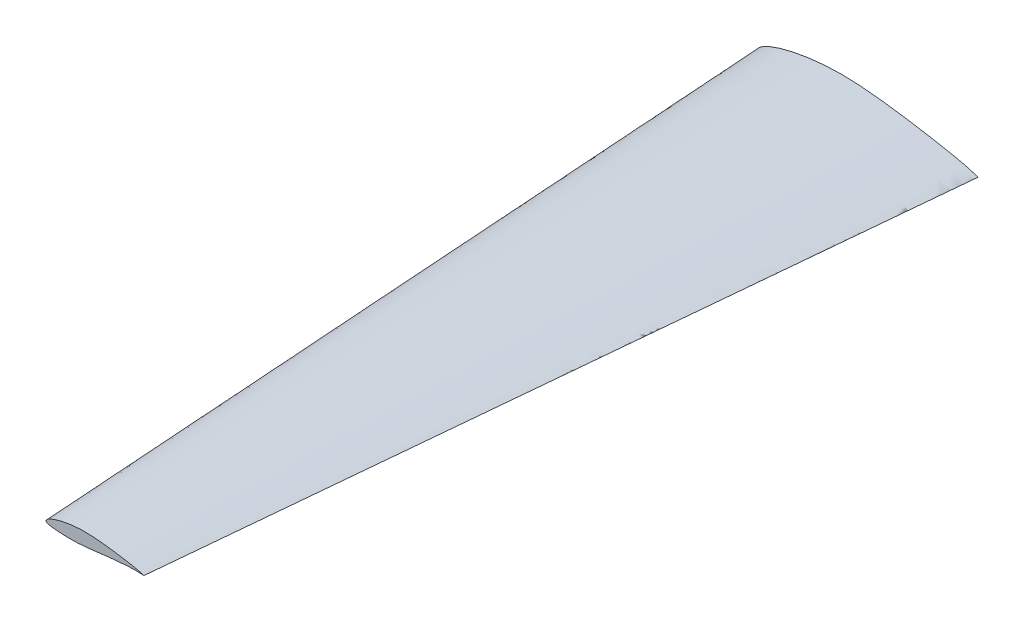
ISO-10303-21;
HEADER;
FILE_DESCRIPTION(('STEP AP214'),'2;1');
FILE_NAME('part.step','',(''),(''),'','','');
FILE_SCHEMA(('AUTOMOTIVE_DESIGN { 1 0 10303 214 1 1 1 1 }'));
ENDSEC;
DATA;
#1=APPLICATION_CONTEXT('core data for automotive mechanical design processes');
#2=APPLICATION_PROTOCOL_DEFINITION('international standard','automotive_design',2000,#1);
#3=PRODUCT_CONTEXT('',#1,'mechanical');
#4=PRODUCT('Part','Part','',(#3));
#5=PRODUCT_RELATED_PRODUCT_CATEGORY('part','',(#4));
#6=PRODUCT_DEFINITION_FORMATION('','',#4);
#7=PRODUCT_DEFINITION_CONTEXT('part definition',#1,'design');
#8=PRODUCT_DEFINITION('design','',#6,#7);
#9=PRODUCT_DEFINITION_SHAPE('','',#8);
#10=(LENGTH_UNIT() NAMED_UNIT(*) SI_UNIT(.MILLI.,.METRE.));
#11=(NAMED_UNIT(*) PLANE_ANGLE_UNIT() SI_UNIT($,.RADIAN.));
#12=(NAMED_UNIT(*) SI_UNIT($,.STERADIAN.) SOLID_ANGLE_UNIT());
#13=UNCERTAINTY_MEASURE_WITH_UNIT(LENGTH_MEASURE(1.E-05),#10,'distance_accuracy_value','');
#14=(GEOMETRIC_REPRESENTATION_CONTEXT(3) GLOBAL_UNCERTAINTY_ASSIGNED_CONTEXT((#13)) GLOBAL_UNIT_ASSIGNED_CONTEXT((#10,
#11,#12)) REPRESENTATION_CONTEXT('',''));
#15=CARTESIAN_POINT('',(0.,0.,0.));
#16=DIRECTION('',(0.,0.,1.));
#17=DIRECTION('',(1.,0.,0.));
#18=AXIS2_PLACEMENT_3D('',#15,#16,#17);
#19=CARTESIAN_POINT('',(-1154.67997113277,-18.9639866159089,0.));
#20=DIRECTION('',(0.,0.,-1.));
#21=DIRECTION('',(-1.,0.,0.));
#22=AXIS2_PLACEMENT_3D('',#19,#20,#21);
#23=PLANE('',#22);
#24=CARTESIAN_POINT('',(637.205898192704,-30.8287655417815,0.));
#25=CARTESIAN_POINT('',(637.201899095165,-30.6617141837894,0.));
#26=CARTESIAN_POINT('',(624.340560361227,-27.2829794764373,0.));
#27=CARTESIAN_POINT('',(612.180848443958,-22.4384339408856,0.));
#28=CARTESIAN_POINT('',(584.1934966163,-12.9236065949599,0.));
#29=CARTESIAN_POINT('',(550.573388405335,-3.00306264153049,0.));
#30=CARTESIAN_POINT('',(507.031775344727,7.31757291672287,0.));
#31=CARTESIAN_POINT('',(455.545202677299,18.4127610030455,0.));
#32=CARTESIAN_POINT('',(396.045342981437,30.4121098513646,0.));
#33=CARTESIAN_POINT('',(329.608830024776,43.1367783526144,0.));
#34=CARTESIAN_POINT('',(257.103677447065,56.3698310078444,0.));
#35=CARTESIAN_POINT('',(179.566044984712,69.8811959522331,0.));
#36=CARTESIAN_POINT('',(98.0040149305177,83.2871979527405,0.));
#37=CARTESIAN_POINT('',(13.4916001870969,96.2741526462915,0.));
#38=CARTESIAN_POINT('',(-72.9444245741009,108.416502290215,0.));
#39=CARTESIAN_POINT('',(-160.276589340614,119.243860555077,0.));
#40=CARTESIAN_POINT('',(-247.524811414299,128.361079009185,0.));
#41=CARTESIAN_POINT('',(-333.850816491668,135.206641048699,0.));
#42=CARTESIAN_POINT('',(-418.62279166819,139.050084763409,0.));
#43=CARTESIAN_POINT('',(-501.360886667318,139.671030910781,0.));
#44=CARTESIAN_POINT('',(-581.716263489697,136.885357982169,0.));
#45=CARTESIAN_POINT('',(-659.296624774083,130.867982416211,0.));
#46=CARTESIAN_POINT('',(-733.606389984446,122.220462802317,0.));
#47=CARTESIAN_POINT('',(-804.005192472441,111.471174797557,0.));
#48=CARTESIAN_POINT('',(-869.742959712326,98.8183249705576,0.));
#49=CARTESIAN_POINT('',(-930.149362586197,84.6626316298686,0.));
#50=CARTESIAN_POINT('',(-984.604323928922,69.3091730998716,0.));
#51=CARTESIAN_POINT('',(-1032.52610252396,53.0958706696138,0.));
#52=CARTESIAN_POINT('',(-1073.44710571588,36.391875667701,0.));
#53=CARTESIAN_POINT('',(-1106.97281951812,19.4367425763099,0.));
#54=CARTESIAN_POINT('',(-1132.81440521732,2.65228106861395,0.));
#55=CARTESIAN_POINT('',(-1147.69800566304,-10.4496016700711,0.));
#56=CARTESIAN_POINT('',(-1155.93792618086,-20.4072267704912,0.));
#57=CARTESIAN_POINT('',(-1159.73603262891,-26.1420092113419,0.));
#58=CARTESIAN_POINT('',(-1162.29687404882,-32.2887637968773,0.));
#59=CARTESIAN_POINT('',(-1163.02961498736,-36.0635081413664,0.));
#60=CARTESIAN_POINT('',(-1162.88645541477,-38.7085659438932,0.));
#61=CARTESIAN_POINT('',(-1161.82222186532,-41.1953992990109,0.));
#62=CARTESIAN_POINT('',(-1159.33848344514,-44.3902386327544,0.));
#63=CARTESIAN_POINT('',(-1154.04337356053,-49.2444985030971,0.));
#64=CARTESIAN_POINT('',(-1143.54648919571,-55.9865112754625,0.));
#65=CARTESIAN_POINT('',(-1124.17422283292,-64.496278877395,0.));
#66=CARTESIAN_POINT('',(-1094.69974337827,-73.384985572832,0.));
#67=CARTESIAN_POINT('',(-1055.14192052983,-81.756543547593,0.));
#68=CARTESIAN_POINT('',(-1007.21961769442,-89.0071543211266,0.));
#69=CARTESIAN_POINT('',(-951.470022218796,-95.2724233138396,0.));
#70=CARTESIAN_POINT('',(-888.557803111172,-100.396692502895,0.));
#71=CARTESIAN_POINT('',(-819.285797118707,-104.232978137697,0.));
#72=CARTESIAN_POINT('',(-744.520854987428,-106.629067947558,0.));
#73=CARTESIAN_POINT('',(-665.068638724127,-107.227734162227,0.));
#74=CARTESIAN_POINT('',(-581.618577699989,-105.540984685579,0.));
#75=CARTESIAN_POINT('',(-494.657700858437,-101.259128330527,0.));
#76=CARTESIAN_POINT('',(-404.474359226252,-94.1471454469288,0.));
#77=CARTESIAN_POINT('',(-311.376736229075,-84.5975961097064,0.));
#78=CARTESIAN_POINT('',(-215.89334635615,-74.0273472659613,0.));
#79=CARTESIAN_POINT('',(-119.080288018422,-63.2442750785889,0.));
#80=CARTESIAN_POINT('',(-22.3000935122685,-52.9711250135226,0.));
#81=CARTESIAN_POINT('',(72.993589670017,-43.6696490132337,0.));
#82=CARTESIAN_POINT('',(165.297776875109,-35.8584715469645,0.));
#83=CARTESIAN_POINT('',(253.084648037599,-29.7869699753317,0.));
#84=CARTESIAN_POINT('',(334.812275151983,-25.5512188260446,0.));
#85=CARTESIAN_POINT('',(409.125030592602,-23.2680963711777,0.));
#86=CARTESIAN_POINT('',(474.371672980515,-22.6259520258617,0.));
#87=CARTESIAN_POINT('',(530.172780584082,-23.5565126327113,0.));
#88=CARTESIAN_POINT('',(573.20612192453,-25.027782672938,0.));
#89=CARTESIAN_POINT('',(608.39684892439,-27.7924208570704,0.));
#90=CARTESIAN_POINT('',(622.966968367519,-28.6400352563432,0.));
#91=CARTESIAN_POINT('',(637.210029137364,-31.001324452546,0.));
#92=CARTESIAN_POINT('',(637.205898192704,-30.8287655417815,0.));
#93=B_SPLINE_CURVE_WITH_KNOTS('',3,(#24,#25,#26,#27,#28,#29,#30,#31,#32,#33,#34,#35,#36,#37,#38,
#39,#40,#41,#42,#43,#44,#45,#46,#47,#48,#49,#50,#51,#52,#53,#54,#55,#56,#57,#58,#59,#60,#61,#62,
#63,#64,#65,#66,#67,#68,#69,#70,#71,#72,#73,#74,#75,#76,#77,#78,#79,#80,#81,#82,#83,#84,#85,#86,
#87,#88,#89,#90,#91,#92),.UNSPECIFIED.,.T.,.F.,(4,1,1,1,1,1,1,1,1,1,1,1,1,1,1,1,1,1,1,1,1,1,1,1,
1,1,1,1,1,1,1,1,1,1,1,1,1,1,1,1,1,1,1,1,1,1,1,1,1,1,1,1,1,1,1,1,1,1,1,1,1,1,1,1,1,1,4),(0.,
0.00178025429931348,0.00677661855276226,0.014307631931115,0.0240462466109695,0.0361164032384218,
0.0505469730630571,0.0671298835400742,0.0856244289456062,0.10576729194862,0.127282098412942,
0.149864114045041,0.173229760189317,0.197069077892929,0.221103034083199,0.245051957369849,
0.268663179942347,0.291772797822348,0.314298508345449,0.336177511433891,0.357377359215959,
0.377791670496789,0.397224888102935,0.415489312865215,0.432417328029751,0.447849235180273,
0.461650757544391,0.473686992386839,0.483898395757803,0.492262508108233,0.498796820958936,
0.499955027372734,0.502810607326279,0.504371243067385,0.50535998755193,0.505924933279694,
0.506503368203689,0.507535007041587,0.509204749770686,0.512345281497249,0.517665407870953,
0.526421681932562,0.537424925562334,0.550643204547595,0.565965823835836,0.583206168779579,
0.6021549785986,0.622586582637333,0.644254823208852,0.666997978581174,0.690702845759673,
0.715307475272001,0.740824202204505,0.767084355637659,0.793717038600972,0.82033109971691,
0.846519300878587,0.871863223081629,0.895937170924907,0.918334876492831,0.938667169413558,
0.956573464196435,0.971715275283217,0.983839006179547,0.992717916559063,0.998161052107173,1.),.UNSPECIFIED.);
#94=CARTESIAN_POINT('',(637.205898192704,-30.8287655417815,0.));
#95=VERTEX_POINT('',#94);
#96=EDGE_CURVE('E64',#95,#95,#93,.T.);
#97=ORIENTED_EDGE('',*,*,#96,.F.);
#98=EDGE_LOOP('',(#97));
#99=FACE_BOUND('',#98,.T.);
#100=DIRECTION('',(-1.,0.,0.));
#101=VECTOR('',#100,1.);
#102=CARTESIAN_POINT('',(-378.662123766315,-50.9305698518282,0.));
#103=LINE('',#102,#101);
#104=CARTESIAN_POINT('',(-378.662123766315,-50.9305698518282,0.));
#105=VERTEX_POINT('',#104);
#106=CARTESIAN_POINT('',(-605.033690274723,-50.9305698518282,0.));
#107=VERTEX_POINT('',#106);
#108=EDGE_CURVE('E113',#105,#107,#103,.T.);
#109=ORIENTED_EDGE('',*,*,#108,.F.);
#110=DIRECTION('',(0.,-1.,0.));
#111=VECTOR('',#110,1.);
#112=CARTESIAN_POINT('',(-378.662123766315,100.87153945381,0.));
#113=LINE('',#112,#111);
#114=CARTESIAN_POINT('',(-378.662123766315,100.87153945381,0.));
#115=VERTEX_POINT('',#114);
#116=EDGE_CURVE('E127',#115,#105,#113,.T.);
#117=ORIENTED_EDGE('',*,*,#116,.F.);
#118=DIRECTION('',(1.,0.,0.));
#119=VECTOR('',#118,1.);
#120=CARTESIAN_POINT('',(-378.662123766315,100.87153945381,0.));
#121=LINE('',#120,#119);
#122=CARTESIAN_POINT('',(-605.033690274723,100.87153945381,0.));
#123=VERTEX_POINT('',#122);
#124=EDGE_CURVE('E93',#123,#115,#121,.T.);
#125=ORIENTED_EDGE('',*,*,#124,.F.);
#126=DIRECTION('',(0.,1.,0.));
#127=VECTOR('',#126,1.);
#128=CARTESIAN_POINT('',(-605.033690274723,100.87153945381,0.));
#129=LINE('',#128,#127);
#130=EDGE_CURVE('E133',#107,#123,#129,.T.);
#131=ORIENTED_EDGE('',*,*,#130,.F.);
#132=EDGE_LOOP('',(#109,#117,#125,#131));
#133=FACE_BOUND('',#132,.T.);
#134=ADVANCED_FACE('F51',(#99,#133),#23,.T.);
#135=CARTESIAN_POINT('',(-747.653077521207,-40.6182657315667,6200.));
#136=DIRECTION('',(0.,0.,-1.));
#137=DIRECTION('',(-1.,0.,0.));
#138=AXIS2_PLACEMENT_3D('',#135,#136,#137);
#139=PLANE('',#138);
#140=CARTESIAN_POINT('',(46.231204019507,-35.2354448345607,6200.));
#141=CARTESIAN_POINT('',(46.2284405656363,-35.161464044046,6200.));
#142=CARTESIAN_POINT('',(40.5107466597847,-33.7410304315181,6200.));
#143=CARTESIAN_POINT('',(35.095173755005,-31.6670699807893,6200.));
#144=CARTESIAN_POINT('',(22.6401533138637,-27.6181263346662,6200.));
#145=CARTESIAN_POINT('',(7.68738653694873,-23.4228917248776,6200.));
#146=CARTESIAN_POINT('',(-11.6630288456523,-19.1093216631822,6200.));
#147=CARTESIAN_POINT('',(-34.5376973183015,-14.4997928532483,6200.));
#148=CARTESIAN_POINT('',(-60.9676577726097,-9.5372939208794,6200.));
#149=CARTESIAN_POINT('',(-90.4748945702333,-4.29466001199642,6200.));
#150=CARTESIAN_POINT('',(-122.673585589033,1.13715909285272,6200.));
#151=CARTESIAN_POINT('',(-157.103341203516,6.66239247620247,6200.));
#152=CARTESIAN_POINT('',(-193.315298237174,12.1170555043395,6200.));
#153=CARTESIAN_POINT('',(-230.831801501577,17.3685612770775,6200.));
#154=CARTESIAN_POINT('',(-269.195458339637,22.2344819950382,6200.));
#155=CARTESIAN_POINT('',(-307.948301893932,26.5125347132972,6200.));
#156=CARTESIAN_POINT('',(-346.653804819708,30.0334858752315,6200.));
#157=CARTESIAN_POINT('',(-384.937273776908,32.5535580846316,6200.));
#158=CARTESIAN_POINT('',(-422.514475712798,33.7529045585345,6200.));
#159=CARTESIAN_POINT('',(-459.17152624748,33.5367452774346,6200.));
#160=CARTESIAN_POINT('',(-494.752795326995,31.8255847079449,6200.));
#161=CARTESIAN_POINT('',(-529.085531914352,28.6992408412461,6200.));
#162=CARTESIAN_POINT('',(-561.953763146873,24.4271493642645,6200.));
#163=CARTESIAN_POINT('',(-593.076940726259,19.2471852213284,6200.));
#164=CARTESIAN_POINT('',(-622.123955821754,13.2516082607377,6200.));
#165=CARTESIAN_POINT('',(-648.800228679982,6.62191851956731,6200.));
#166=CARTESIAN_POINT('',(-672.832873554333,-0.503051287442359,6200.));
#167=CARTESIAN_POINT('',(-693.96618270177,-7.97014647053786,6200.));
#168=CARTESIAN_POINT('',(-711.995202148996,-15.6130550209624,6200.));
#169=CARTESIAN_POINT('',(-726.74658265942,-23.3233108305785,6200.));
#170=CARTESIAN_POINT('',(-738.094871742379,-30.9123353139702,6200.));
#171=CARTESIAN_POINT('',(-744.610586604553,-36.8048992419908,6200.));
#172=CARTESIAN_POINT('',(-748.201788544685,-41.2650967461758,6200.));
#173=CARTESIAN_POINT('',(-749.850318344285,-43.828182757875,6200.));
#174=CARTESIAN_POINT('',(-750.94828793429,-46.5664283398626,6200.));
#175=CARTESIAN_POINT('',(-751.250483793828,-48.2430082792743,6200.));
#176=CARTESIAN_POINT('',(-751.171358916499,-49.4139312981977,6200.));
#177=CARTESIAN_POINT('',(-750.685133378202,-50.5092914480428,6200.));
#178=CARTESIAN_POINT('',(-749.565856882824,-51.9098735302076,6200.));
#179=CARTESIAN_POINT('',(-747.191277168439,-54.0288947151431,6200.));
#180=CARTESIAN_POINT('',(-742.501078818877,-56.9533147580623,6200.));
#181=CARTESIAN_POINT('',(-733.868548954772,-60.6081626209987,6200.));
#182=CARTESIAN_POINT('',(-720.75844147582,-64.3709023541952,6200.));
#183=CARTESIAN_POINT('',(-703.184436093652,-67.8446748921428,6200.));
#184=CARTESIAN_POINT('',(-681.911582287878,-70.772200095514,6200.));
#185=CARTESIAN_POINT('',(-657.177051439535,-73.2167412462913,6200.));
#186=CARTESIAN_POINT('',(-629.276219223052,-75.1132874538173,6200.));
#187=CARTESIAN_POINT('',(-598.56561876685,-76.4014909147392,6200.));
#188=CARTESIAN_POINT('',(-565.43017274413,-77.0190676374616,6200.));
#189=CARTESIAN_POINT('',(-530.228914169513,-76.8125475071701,6200.));
#190=CARTESIAN_POINT('',(-493.270160843118,-75.5698410912889,6200.));
#191=CARTESIAN_POINT('',(-454.771507600199,-73.1566453823038,6200.));
#192=CARTESIAN_POINT('',(-414.862090680234,-69.4705576020164,6200.));
#193=CARTESIAN_POINT('',(-373.676106035862,-64.6873134822189,6200.));
#194=CARTESIAN_POINT('',(-331.439275690689,-59.4377296716919,6200.));
#195=CARTESIAN_POINT('',(-288.614659582081,-54.0859694749774,6200.));
#196=CARTESIAN_POINT('',(-245.801574741511,-48.9603022904963,6200.));
#197=CARTESIAN_POINT('',(-203.641252257449,-44.2739171415237,6200.));
#198=CARTESIAN_POINT('',(-162.796442142331,-40.2654907769843,6200.));
#199=CARTESIAN_POINT('',(-123.942495214821,-37.0545696704387,6200.));
#200=CARTESIAN_POINT('',(-87.7619223828843,-34.6928701852552,6200.));
#201=CARTESIAN_POINT('',(-54.8545790950461,-33.2402187187982,6200.));
#202=CARTESIAN_POINT('',(-25.9538233844276,-32.5683565258773,6200.));
#203=CARTESIAN_POINT('',(-1.22814621466564,-32.6492910205264,6200.));
#204=CARTESIAN_POINT('',(17.844561028956,-33.0455684548176,6200.));
#205=CARTESIAN_POINT('',(33.4506324915198,-34.0613780335465,6200.));
#206=CARTESIAN_POINT('',(39.9102962245878,-34.3503679361492,6200.));
#207=CARTESIAN_POINT('',(46.2340585822929,-35.311864713945,6200.));
#208=CARTESIAN_POINT('',(46.231204019507,-35.2354448345607,6200.));
#209=B_SPLINE_CURVE_WITH_KNOTS('',3,(#140,#141,#142,#143,#144,#145,#146,#147,#148,#149,#150,
#151,#152,#153,#154,#155,#156,#157,#158,#159,#160,#161,#162,#163,#164,#165,#166,#167,#168,#169,
#170,#171,#172,#173,#174,#175,#176,#177,#178,#179,#180,#181,#182,#183,#184,#185,#186,#187,#188,
#189,#190,#191,#192,#193,#194,#195,#196,#197,#198,#199,#200,#201,#202,#203,#204,#205,#206,#207,
#208),.UNSPECIFIED.,.T.,.F.,(4,1,1,1,1,1,1,1,1,1,1,1,1,1,1,1,1,1,1,1,1,1,1,1,1,1,1,1,1,1,1,1,1,
1,1,1,1,1,1,1,1,1,1,1,1,1,1,1,1,1,1,1,1,1,1,1,1,1,1,1,1,1,1,1,1,1,4),(0.,0.00178025429931348,
0.00677661855276226,0.014307631931115,0.0240462466109695,0.0361164032384218,0.0505469730630571,
0.0671298835400742,0.0856244289456062,0.10576729194862,0.127282098412942,0.149864114045041,
0.173229760189317,0.197069077892929,0.221103034083199,0.245051957369849,0.268663179942347,
0.291772797822348,0.314298508345449,0.336177511433891,0.357377359215959,0.377791670496789,
0.397224888102935,0.415489312865215,0.432417328029751,0.447849235180273,0.461650757544391,
0.473686992386839,0.483898395757803,0.492262508108233,0.498796820958936,0.499955027372734,
0.502810607326279,0.504371243067385,0.50535998755193,0.505924933279694,0.506503368203689,
0.507535007041587,0.509204749770686,0.512345281497249,0.517665407870953,0.526421681932562,
0.537424925562334,0.550643204547595,0.565965823835836,0.583206168779579,0.6021549785986,
0.622586582637333,0.644254823208852,0.666997978581174,0.690702845759673,0.715307475272001,
0.740824202204505,0.767084355637659,0.793717038600972,0.82033109971691,0.846519300878587,
0.871863223081629,0.895937170924907,0.918334876492831,0.938667169413558,0.956573464196435,
0.971715275283217,0.983839006179547,0.992717916559063,0.998161052107173,1.),.UNSPECIFIED.);
#210=CARTESIAN_POINT('',(46.231204019507,-35.2354448345607,6200.));
#211=VERTEX_POINT('',#210);
#212=EDGE_CURVE('E12',#211,#211,#209,.T.);
#213=ORIENTED_EDGE('',*,*,#212,.T.);
#214=EDGE_LOOP('',(#213));
#215=FACE_BOUND('',#214,.T.);
#216=ADVANCED_FACE('F53',(#215),#139,.F.);
#217=CARTESIAN_POINT('',(-1162.90430000894,-36.010271297111,0.));
#218=CARTESIAN_POINT('',(-751.127407137551,-47.6464509229914,6200.));
#219=CARTESIAN_POINT('',(-1162.92051700588,-36.2047277608436,0.));
#220=CARTESIAN_POINT('',(-751.14142513213,-47.7317010378396,6200.));
#221=CARTESIAN_POINT('',(-1162.95828590428,-36.8333009797402,0.));
#222=CARTESIAN_POINT('',(-751.181479745274,-48.0073492187059,6200.));
#223=CARTESIAN_POINT('',(-1162.93950422828,-37.7284206728293,0.));
#224=CARTESIAN_POINT('',(-751.212003010877,-48.4002126372902,6200.));
#225=CARTESIAN_POINT('',(-1162.75806646853,-38.8399966686517,0.));
#226=CARTESIAN_POINT('',(-751.205936581557,-48.9022365528266,6200.));
#227=CARTESIAN_POINT('',(-1162.43715617724,-39.7584598613452,0.));
#228=CARTESIAN_POINT('',(-751.149350948429,-49.3294659917411,6200.));
#229=CARTESIAN_POINT('',(-1161.92646618367,-40.7891683470772,0.));
#230=CARTESIAN_POINT('',(-750.994737816625,-49.8118201361654,6200.));
#231=CARTESIAN_POINT('',(-1161.11663317046,-42.1029999132474,0.));
#232=CARTESIAN_POINT('',(-750.693102250106,-50.4312829941758,6200.));
#233=CARTESIAN_POINT('',(-1160.04083173092,-43.4261323472656,0.));
#234=CARTESIAN_POINT('',(-750.256246487288,-51.0459696479064,6200.));
#235=CARTESIAN_POINT('',(-1158.08316926316,-45.5410402952428,0.));
#236=CARTESIAN_POINT('',(-749.416488376659,-52.0107554517047,6200.));
#237=CARTESIAN_POINT('',(-1156.23019430949,-47.1974871194794,0.));
#238=CARTESIAN_POINT('',(-748.611427802237,-52.7615844367858,6200.));
#239=CARTESIAN_POINT('',(-1151.94713749663,-50.5908837566148,0.));
#240=CARTESIAN_POINT('',(-746.730863479948,-54.2879264972246,6200.));
#241=CARTESIAN_POINT('',(-1148.31391783736,-52.8911267648315,0.));
#242=CARTESIAN_POINT('',(-745.127778881206,-55.3155216976197,6200.));
#243=CARTESIAN_POINT('',(-1139.61526846819,-57.7134013644461,0.));
#244=CARTESIAN_POINT('',(-741.271616253597,-57.4518931681089,6200.));
#245=CARTESIAN_POINT('',(-1133.22446961501,-60.4976797618334,0.));
#246=CARTESIAN_POINT('',(-738.436071417425,-58.6743610617412,6200.));
#247=CARTESIAN_POINT('',(-1117.50660530661,-66.5070521851947,0.));
#248=CARTESIAN_POINT('',(-731.452005928495,-61.2861024299933,6200.));
#249=CARTESIAN_POINT('',(-1106.79674918026,-69.7192819064195,0.));
#250=CARTESIAN_POINT('',(-726.694952758834,-62.6670607253582,6200.));
#251=CARTESIAN_POINT('',(-1083.77253774689,-75.6974924010188,0.));
#252=CARTESIAN_POINT('',(-716.466679165266,-65.2097515079323,6200.));
#253=CARTESIAN_POINT('',(-1070.14798292222,-78.5687239096391,0.));
#254=CARTESIAN_POINT('',(-710.416790483915,-66.4150887779212,6200.));
#255=CARTESIAN_POINT('',(-1041.37927458624,-83.8388222163296,0.));
#256=CARTESIAN_POINT('',(-697.644342595635,-68.6007561784582,6200.));
#257=CARTESIAN_POINT('',(-1024.93131069943,-86.3194258730443,0.));
#258=CARTESIAN_POINT('',(-690.344479221008,-69.6116826334672,6200.));
#259=CARTESIAN_POINT('',(-990.692971942089,-90.8644571464163,0.));
#260=CARTESIAN_POINT('',(-675.151371615518,-71.4362702565338,6200.));
#261=CARTESIAN_POINT('',(-971.603180748062,-93.003387014006,0.));
#262=CARTESIAN_POINT('',(-666.682488130611,-72.2773083825788,6200.));
#263=CARTESIAN_POINT('',(-932.324743638965,-96.8318272346373,0.));
#264=CARTESIAN_POINT('',(-649.260178746018,-73.7517046735597,6200.));
#265=CARTESIAN_POINT('',(-910.836949284791,-98.5765530297146,0.));
#266=CARTESIAN_POINT('',(-639.73101548564,-74.4026274975686,6200.));
#267=CARTESIAN_POINT('',(-867.03305601999,-101.58873360053,0.));
#268=CARTESIAN_POINT('',(-620.308326956115,-75.486802895482,6200.));
#269=CARTESIAN_POINT('',(-843.417892861192,-102.891593827696,0.));
#270=CARTESIAN_POINT('',(-609.839170905086,-75.9286043978483,6200.));
#271=CARTESIAN_POINT('',(-795.646920766998,-104.990564101496,0.));
#272=CARTESIAN_POINT('',(-588.664210241904,-76.5836753733088,6200.));
#273=CARTESIAN_POINT('',(-770.191990263446,-105.801112322982,0.));
#274=CARTESIAN_POINT('',(-577.382832209052,-76.7962945908848,6200.));
#275=CARTESIAN_POINT('',(-719.053076037356,-106.820965663407,0.));
#276=CARTESIAN_POINT('',(-554.722067026049,-76.9537868757262,6200.));
#277=CARTESIAN_POINT('',(-692.070077807331,-107.018325104336,0.));
#278=CARTESIAN_POINT('',(-542.767268643542,-76.8861080190515,6200.));
#279=CARTESIAN_POINT('',(-638.089774283471,-106.682418977105,0.));
#280=CARTESIAN_POINT('',(-518.85553536317,-76.4273586963049,6200.));
#281=CARTESIAN_POINT('',(-609.794232768652,-106.104249085647,0.));
#282=CARTESIAN_POINT('',(-506.323726287629,-76.00875604561,6200.));
#283=CARTESIAN_POINT('',(-553.350969112621,-104.149119241392,0.));
#284=CARTESIAN_POINT('',(-481.330177815911,-74.8185266368609,6200.));
#285=CARTESIAN_POINT('',(-523.906737864093,-102.692951447115,0.));
#286=CARTESIAN_POINT('',(-468.294534369807,-74.0043038696539,6200.));
#287=CARTESIAN_POINT('',(-465.269139856987,-98.9415058180637,0.));
#288=CARTESIAN_POINT('',(-442.339202583138,-72.0054456539621,6200.));
#289=CARTESIAN_POINT('',(-434.781940137164,-96.5321580641996,0.));
#290=CARTESIAN_POINT('',(-428.847066353092,-70.7622288894901,6200.));
#291=CARTESIAN_POINT('',(-374.05437274898,-91.0267955137071,0.));
#292=CARTESIAN_POINT('',(-401.976193920792,-67.9716757541424,6200.));
#293=CARTESIAN_POINT('',(-342.52286999739,-87.7906840748762,0.));
#294=CARTESIAN_POINT('',(-388.026457907883,-66.3539298518788,6200.));
#295=CARTESIAN_POINT('',(-279.873455725877,-81.1101045705363,0.));
#296=CARTESIAN_POINT('',(-360.311756195002,-63.0254702980006,6200.));
#297=CARTESIAN_POINT('',(-247.464881019271,-77.5222479783369,0.));
#298=CARTESIAN_POINT('',(-345.97580160877,-61.2444635221544,6200.));
#299=CARTESIAN_POINT('',(-183.486970194721,-70.4179137920097,0.));
#300=CARTESIAN_POINT('',(-317.67543865908,-57.7176072400212,6200.));
#301=CARTESIAN_POINT('',(-150.6268530791,-66.7590836881734,0.));
#302=CARTESIAN_POINT('',(-303.140030241952,-55.9011941659093,6200.));
#303=CARTESIAN_POINT('',(-86.2016943412436,-59.7542353189301,0.));
#304=CARTESIAN_POINT('',(-274.641213520155,-52.4135466090698,6200.));
#305=CARTESIAN_POINT('',(-53.345595564522,-56.2684626551629,0.));
#306=CARTESIAN_POINT('',(-260.106661836917,-50.6729356073692,6200.));
#307=CARTESIAN_POINT('',(10.5846824035014,-49.7612904920643,0.));
#308=CARTESIAN_POINT('',(-231.824260001459,-47.4074556833747,6200.));
#309=CARTESIAN_POINT('',(42.9504124742033,-46.6050038311394,0.));
#310=CARTESIAN_POINT('',(-217.505056961184,-45.8149662759653,6200.));
#311=CARTESIAN_POINT('',(105.396969886383,-40.9275355616019,0.));
#312=CARTESIAN_POINT('',(-189.875157787999,-42.9241781081205,6200.));
#313=CARTESIAN_POINT('',(136.769888645999,-38.2760966996364,0.));
#314=CARTESIAN_POINT('',(-175.992823604059,-41.5605567405333,6200.));
#315=CARTESIAN_POINT('',(196.709894193326,-33.6859517027061,0.));
#316=CARTESIAN_POINT('',(-149.466929054913,-39.1653912946596,6200.));
#317=CARTESIAN_POINT('',(226.569789574539,-31.6247246782842,0.));
#318=CARTESIAN_POINT('',(-136.251337683896,-38.0717822114152,6200.));
#319=CARTESIAN_POINT('',(282.968833424865,-28.2381427663579,0.));
#320=CARTESIAN_POINT('',(-111.286803426713,-36.2300900327708,6200.));
#321=CARTESIAN_POINT('',(310.802717242567,-26.8004433482933,0.));
#322=CARTESIAN_POINT('',(-98.9651052741872,-35.4241618480409,6200.));
#323=CARTESIAN_POINT('',(362.694757549873,-24.6945809408982,0.));
#324=CARTESIAN_POINT('',(-75.9899672258875,-34.1751701427918,6200.));
#325=CARTESIAN_POINT('',(388.045353538575,-23.9206087221476,0.));
#326=CARTESIAN_POINT('',(-64.7640727036485,-33.6776603042969,6200.));
#327=CARTESIAN_POINT('',(434.408953615054,-23.0192570807243,0.));
#328=CARTESIAN_POINT('',(-44.2292297655829,-32.9951221570591,6200.));
#329=CARTESIAN_POINT('',(456.730129024212,-22.8059711790784,0.));
#330=CARTESIAN_POINT('',(-34.3430563613789,-32.763382860872,6200.));
#331=CARTESIAN_POINT('',(496.927894664348,-23.0021082033961,0.));
#332=CARTESIAN_POINT('',(-16.5382582317236,-32.6015550028647,6200.));
#333=CARTESIAN_POINT('',(516.060151013691,-23.3253514997068,0.));
#334=CARTESIAN_POINT('',(-8.05769346037086,-32.6269358813236,6200.));
#335=CARTESIAN_POINT('',(548.621162876869,-24.1872457180949,0.));
#336=CARTESIAN_POINT('',(6.38583708555751,-32.8090373118029,6200.));
#337=CARTESIAN_POINT('',(563.505640747982,-24.7085251611544,0.));
#338=CARTESIAN_POINT('',(12.9729042702342,-32.9443490727743,6200.));
#339=CARTESIAN_POINT('',(589.809000037014,-26.3321305710775,0.));
#340=CARTESIAN_POINT('',(24.5916797934128,-33.4883744378349,6200.));
#341=CARTESIAN_POINT('',(601.996348163368,-27.285401619129,0.));
#342=CARTESIAN_POINT('',(30.03006042549,-33.8387307210732,6200.));
#343=CARTESIAN_POINT('',(616.720254094529,-28.2766336393148,0.));
#344=CARTESIAN_POINT('',(36.6899311496249,-34.2045790935945,6200.));
#345=CARTESIAN_POINT('',(622.242609223136,-28.6570872428781,0.));
#346=CARTESIAN_POINT('',(39.0340366974602,-34.3111661810945,6200.));
#347=CARTESIAN_POINT('',(634.304255826598,-30.5195901374152,0.));
#348=CARTESIAN_POINT('',(44.0733446394874,-34.9879008816027,6200.));
#349=CARTESIAN_POINT('',(637.767352204719,-31.0543550713085,0.));
#350=CARTESIAN_POINT('',(45.9272473515707,-35.2652155843534,6200.));
#351=CARTESIAN_POINT('',(636.531359390657,-30.4855602219704,0.));
#352=CARTESIAN_POINT('',(46.4680358961861,-35.2384187687712,6200.));
#353=CARTESIAN_POINT('',(632.598653887573,-29.4395907888475,0.));
#354=CARTESIAN_POINT('',(45.0244696021425,-34.8623642927802,6200.));
#355=CARTESIAN_POINT('',(622.527298587213,-26.5605586418112,0.));
#356=CARTESIAN_POINT('',(40.2341206243334,-33.6034333426219,6200.));
#357=CARTESIAN_POINT('',(617.919324192789,-24.7357804732159,0.));
#358=CARTESIAN_POINT('',(38.0794627096275,-32.8099402503357,6200.));
#359=CARTESIAN_POINT('',(605.456552961758,-20.1523830515375,0.));
#360=CARTESIAN_POINT('',(32.6553805949656,-30.8788003993694,6200.));
#361=CARTESIAN_POINT('',(595.564232461683,-16.79759966716,0.));
#362=CARTESIAN_POINT('',(28.2853129879629,-29.453284574816,6200.));
#363=CARTESIAN_POINT('',(575.158949053144,-10.2577131469904,0.));
#364=CARTESIAN_POINT('',(19.1724246219445,-26.6503419030121,6200.));
#365=CARTESIAN_POINT('',(563.585645312604,-6.85409211465511,0.));
#366=CARTESIAN_POINT('',(14.0188966510992,-25.1992967714753,6200.));
#367=CARTESIAN_POINT('',(538.447932921229,-0.128975113925972,0.));
#368=CARTESIAN_POINT('',(2.85974978337416,-22.3526340151024,6200.));
#369=CARTESIAN_POINT('',(523.522197451257,3.40459866594387,0.));
#370=CARTESIAN_POINT('',(-3.76900719014392,-20.8690469613892,6200.));
#371=CARTESIAN_POINT('',(492.185268141761,10.5169466817212,0.));
#372=CARTESIAN_POINT('',(-17.6957510629968,-17.8959063334472,6200.));
#373=CARTESIAN_POINT('',(474.516835378577,14.3216375678992,0.));
#374=CARTESIAN_POINT('',(-25.5456443902167,-16.3118028101146,6200.));
#375=CARTESIAN_POINT('',(437.777607591648,21.9959555301955,0.));
#376=CARTESIAN_POINT('',(-41.8648224263828,-13.1254579178056,6200.));
#377=CARTESIAN_POINT('',(417.423060215335,26.0987804042736,0.));
#378=CARTESIAN_POINT('',(-50.9056937233297,-11.4265319293285,6200.));
#379=CARTESIAN_POINT('',(375.669090054576,34.314799084333,0.));
#380=CARTESIAN_POINT('',(-69.4513275639072,-8.03099873418249,6200.));
#381=CARTESIAN_POINT('',(352.992529576206,38.656195410745,0.));
#382=CARTESIAN_POINT('',(-79.5226702293248,-6.24057257240141,6200.));
#383=CARTESIAN_POINT('',(306.890358802446,47.2831695433537,0.));
#384=CARTESIAN_POINT('',(-99.9967162284235,-2.68925721914329,6200.));
#385=CARTESIAN_POINT('',(282.184783563856,51.79049854431,0.));
#386=CARTESIAN_POINT('',(-110.967871891671,-0.837558427809834,6200.));
#387=CARTESIAN_POINT('',(232.364695015218,60.6807366851849,0.));
#388=CARTESIAN_POINT('',(-133.090718616217,2.8080684098029,6200.));
#389=CARTESIAN_POINT('',(205.969420457569,65.2781655661902,0.));
#390=CARTESIAN_POINT('',(-144.81097819915,4.6897332684965,6200.));
#391=CARTESIAN_POINT('',(153.127527157508,74.2267820374059,0.));
#392=CARTESIAN_POINT('',(-168.272744518702,8.34388715992015,6200.));
#393=CARTESIAN_POINT('',(125.398401007479,78.7822154416607,0.));
#394=CARTESIAN_POINT('',(-180.583631154224,10.1992648237815,6200.));
#395=CARTESIAN_POINT('',(70.2292143511872,87.5553291834158,0.));
#396=CARTESIAN_POINT('',(-205.075357182463,13.762168612102,6200.));
#397=CARTESIAN_POINT('',(41.5050209986746,91.9665114871112,0.));
#398=CARTESIAN_POINT('',(-217.82618550289,15.5480539922229,6200.));
#399=CARTESIAN_POINT('',(-15.2872184466814,100.3169401201,0.));
#400=CARTESIAN_POINT('',(-243.034336984895,18.9150117197281,6200.));
#401=CARTESIAN_POINT('',(-44.6412234668813,104.436946686601,0.));
#402=CARTESIAN_POINT('',(-256.062404549643,20.5687284200707,6200.));
#403=CARTESIAN_POINT('',(-102.361433621519,112.063594938023,0.));
#404=CARTESIAN_POINT('',(-281.67727664949,23.6107968641405,6200.));
#405=CARTESIAN_POINT('',(-132.015598336515,115.735826760128,0.));
#406=CARTESIAN_POINT('',(-294.835635649197,25.0649847446526,6200.));
#407=CARTESIAN_POINT('',(-189.996150467315,122.349479497358,0.));
#408=CARTESIAN_POINT('',(-320.55981726333,27.6578998973982,6200.));
#409=CARTESIAN_POINT('',(-219.612607883501,125.43876740311,0.));
#410=CARTESIAN_POINT('',(-333.698000986181,28.8549260035531,6200.));
#411=CARTESIAN_POINT('',(-277.210978204034,130.71516102992,0.));
#412=CARTESIAN_POINT('',(-359.244905506049,30.8598960825497,6200.));
#413=CARTESIAN_POINT('',(-306.485112567445,133.029035132263,0.));
#414=CARTESIAN_POINT('',(-372.226857307811,31.7168740487757,6200.));
#415=CARTESIAN_POINT('',(-363.188312970001,136.536762426787,0.));
#416=CARTESIAN_POINT('',(-397.366811804777,32.9470106612055,6200.));
#417=CARTESIAN_POINT('',(-391.911975766159,137.830631342756,0.));
#418=CARTESIAN_POINT('',(-410.098991871917,33.356641239308,6200.));
#419=CARTESIAN_POINT('',(-447.376355624073,139.265879129497,0.));
#420=CARTESIAN_POINT('',(-434.678287394496,33.6775423486159,6200.));
#421=CARTESIAN_POINT('',(-475.414229911228,139.466899337259,0.));
#422=CARTESIAN_POINT('',(-447.100446371808,33.6079260164729,6200.));
#423=CARTESIAN_POINT('',(-529.384121299908,138.699551848954,0.));
#424=CARTESIAN_POINT('',(-471.005220483377,32.9635913100783,6200.));
#425=CARTESIAN_POINT('',(-556.61469756626,137.745994937191,0.));
#426=CARTESIAN_POINT('',(-483.063233533356,32.3877545724089,6200.));
#427=CARTESIAN_POINT('',(-608.881245275119,134.778356997137,0.));
#428=CARTESIAN_POINT('',(-506.201080549589,30.7789828114937,6200.));
#429=CARTESIAN_POINT('',(-635.215542093473,132.72714238374,0.));
#430=CARTESIAN_POINT('',(-517.855832222937,29.7218188890459,6200.));
#431=CARTESIAN_POINT('',(-685.53214717684,127.814922109583,0.));
#432=CARTESIAN_POINT('',(-540.118788289106,27.2614685732158,6200.));
#433=CARTESIAN_POINT('',(-710.810406809436,124.865157821797,0.));
#434=CARTESIAN_POINT('',(-551.300593788726,25.8118090283584,6200.));
#435=CARTESIAN_POINT('',(-758.764990157363,118.378962244102,0.));
#436=CARTESIAN_POINT('',(-572.508172184002,22.6670900594036,6200.));
#437=CARTESIAN_POINT('',(-782.733574385118,114.710288619701,0.));
#438=CARTESIAN_POINT('',(-583.105791709451,20.9067263860822,6200.));
#439=CARTESIAN_POINT('',(-827.816748447316,106.888055313169,0.));
#440=CARTESIAN_POINT('',(-603.034084244006,17.1882015011721,6200.));
#441=CARTESIAN_POINT('',(-850.219846888907,102.566690899999,0.));
#442=CARTESIAN_POINT('',(-612.934669547302,15.1483633280053,6200.));
#443=CARTESIAN_POINT('',(-891.958163011478,93.6123933069808,0.));
#444=CARTESIAN_POINT('',(-631.375133313428,10.948584902588,6200.));
#445=CARTESIAN_POINT('',(-912.576165162208,88.7701550987241,0.));
#446=CARTESIAN_POINT('',(-640.482281189716,8.68912676252112,6200.));
#447=CARTESIAN_POINT('',(-950.535502968056,78.9148034573419,0.));
#448=CARTESIAN_POINT('',(-657.244351257422,4.11413113065656,6200.));
#449=CARTESIAN_POINT('',(-969.153214753463,73.6530901422643,0.));
#450=CARTESIAN_POINT('',(-665.463564111484,1.68173143428174,6200.));
#451=CARTESIAN_POINT('',(-1002.93390123694,63.1077551010744,0.));
#452=CARTESIAN_POINT('',(-680.371919320127,-3.17190918195381,6200.));
#453=CARTESIAN_POINT('',(-1019.36525713674,57.5332076811075,0.));
#454=CARTESIAN_POINT('',(-687.621764667123,-5.72845431454161,6200.));
#455=CARTESIAN_POINT('',(-1048.59387716925,46.5369887646901,0.));
#456=CARTESIAN_POINT('',(-700.513224708011,-10.7517093635621,6200.));
#457=CARTESIAN_POINT('',(-1062.64993457171,40.7782749455464,0.));
#458=CARTESIAN_POINT('',(-706.711546363912,-13.3731939960453,6200.));
#459=CARTESIAN_POINT('',(-1087.01601968887,29.5295984414849,0.));
#460=CARTESIAN_POINT('',(-717.451731220248,-18.4733617403764,6200.));
#461=CARTESIAN_POINT('',(-1098.57312276733,23.6550318783768,0.));
#462=CARTESIAN_POINT('',(-722.545778818277,-21.1276334701891,6200.));
#463=CARTESIAN_POINT('',(-1117.84540867838,12.3748479861824,0.));
#464=CARTESIAN_POINT('',(-731.037271560184,-26.2043245006221,6200.));
#465=CARTESIAN_POINT('',(-1126.79574538987,6.51725998356965,0.));
#466=CARTESIAN_POINT('',(-734.98203913919,-28.8306679660894,6200.));
#467=CARTESIAN_POINT('',(-1140.89496526205,-4.46095410287909,0.));
#468=CARTESIAN_POINT('',(-741.19471559795,-33.7331093397577,6200.));
#469=CARTESIAN_POINT('',(-1147.23329130038,-10.1216147056898,0.));
#470=CARTESIAN_POINT('',(-743.997220987845,-36.2501947799089,6200.));
#471=CARTESIAN_POINT('',(-1153.07844749033,-16.9516574210833,0.));
#472=CARTESIAN_POINT('',(-746.590147530688,-39.2729834142066,6200.));
#473=CARTESIAN_POINT('',(-1154.24592245755,-18.3898322018886,0.));
#474=CARTESIAN_POINT('',(-747.109292328489,-39.908239354684,6200.));
#475=CARTESIAN_POINT('',(-1156.96778829286,-21.9622214072004,0.));
#476=CARTESIAN_POINT('',(-748.32270500573,-41.4831737527192,6200.));
#477=CARTESIAN_POINT('',(-1159.10086605984,-25.2912659213639,0.));
#478=CARTESIAN_POINT('',(-749.284306226337,-42.9481636388296,6200.));
#479=CARTESIAN_POINT('',(-1161.2563858818,-29.7912934880617,0.));
#480=CARTESIAN_POINT('',(-750.272684648343,-44.9240560373193,6200.));
#481=CARTESIAN_POINT('',(-1162.09993706038,-31.9877553874379,0.));
#482=CARTESIAN_POINT('',(-750.675662256429,-45.8865223891553,6200.));
#483=CARTESIAN_POINT('',(-1162.70036753697,-34.418990668313,0.));
#484=CARTESIAN_POINT('',(-750.98713472871,-46.9492209757362,6200.));
#485=CARTESIAN_POINT('',(-1162.85564820786,-35.4268921902613,0.));
#486=CARTESIAN_POINT('',(-751.085352453431,-47.3906963190849,6200.));
#487=CARTESIAN_POINT('',(-1162.90430000894,-36.010271297111,0.));
#488=CARTESIAN_POINT('',(-751.127407137551,-47.6464509229914,6200.));
#489=B_SPLINE_SURFACE_WITH_KNOTS('',3,1,((#217,#218),(#219,#220),(#221,#222),(#223,#224),(#225,
#226),(#227,#228),(#229,#230),(#231,#232),(#233,#234),(#235,#236),(#237,#238),(#239,#240),(#241,
#242),(#243,#244),(#245,#246),(#247,#248),(#249,#250),(#251,#252),(#253,#254),(#255,#256),(#257,
#258),(#259,#260),(#261,#262),(#263,#264),(#265,#266),(#267,#268),(#269,#270),(#271,#272),(#273,
#274),(#275,#276),(#277,#278),(#279,#280),(#281,#282),(#283,#284),(#285,#286),(#287,#288),(#289,
#290),(#291,#292),(#293,#294),(#295,#296),(#297,#298),(#299,#300),(#301,#302),(#303,#304),(#305,
#306),(#307,#308),(#309,#310),(#311,#312),(#313,#314),(#315,#316),(#317,#318),(#319,#320),(#321,
#322),(#323,#324),(#325,#326),(#327,#328),(#329,#330),(#331,#332),(#333,#334),(#335,#336),(#337,
#338),(#339,#340),(#341,#342),(#343,#344),(#345,#346),(#347,#348),(#349,#350),(#351,#352),(#353,
#354),(#355,#356),(#357,#358),(#359,#360),(#361,#362),(#363,#364),(#365,#366),(#367,#368),(#369,
#370),(#371,#372),(#373,#374),(#375,#376),(#377,#378),(#379,#380),(#381,#382),(#383,#384),(#385,
#386),(#387,#388),(#389,#390),(#391,#392),(#393,#394),(#395,#396),(#397,#398),(#399,#400),(#401,
#402),(#403,#404),(#405,#406),(#407,#408),(#409,#410),(#411,#412),(#413,#414),(#415,#416),(#417,
#418),(#419,#420),(#421,#422),(#423,#424),(#425,#426),(#427,#428),(#429,#430),(#431,#432),(#433,
#434),(#435,#436),(#437,#438),(#439,#440),(#441,#442),(#443,#444),(#445,#446),(#447,#448),(#449,
#450),(#451,#452),(#453,#454),(#455,#456),(#457,#458),(#459,#460),(#461,#462),(#463,#464),(#465,
#466),(#467,#468),(#469,#470),(#471,#472),(#473,#474),(#475,#476),(#477,#478),(#479,#480),(#481,
#482),(#483,#484),(#485,#486),(#487,#488)),.UNSPECIFIED.,.T.,.F.,.F.,(4,1,1,1,1,1,1,1,1,1,1,1,1,
1,1,1,1,1,1,1,1,1,1,1,1,1,1,1,1,1,1,1,1,1,1,1,1,1,1,1,1,1,1,1,1,1,1,1,1,1,1,1,1,1,1,1,1,1,1,1,1,
1,1,1,1,1,1,1,1,1,1,1,1,1,1,1,1,1,1,1,1,1,1,1,1,1,1,1,1,1,1,1,1,1,1,1,1,1,1,1,1,1,1,1,1,1,1,1,1,
1,1,1,1,1,1,1,1,1,1,1,1,1,1,1,1,1,1,1,1,1,1,1,1,4),(2,2),(0.,0.00015885756575329,
0.000512163850264979,0.000723803293517289,0.00107710957802898,0.00130223821751252,
0.00165554450202421,0.00233387705541099,0.00268718333992268,0.00400361978450947,
0.00435692606902116,0.00714415151107295,0.00749745779558464,0.0124642778847767,
0.0128175841692884,0.0212205519463854,0.0215738582308971,0.032223795576158,0.0325771018606696,
0.0454420745614181,0.0457953808459298,0.0607646938496591,0.0611180001341708,0.0780050387934029,
0.0783583450779146,0.0969538486124235,0.0973071548969352,0.117385452651157,0.117738758935668,
0.139053693222676,0.139406999507187,0.161796848594998,0.16215015487951,0.185501715773496,
0.185855022058008,0.210106345285825,0.210459651570336,0.235623072218329,0.23597637850284,
0.261883225651483,0.262236531935995,0.288515908614795,0.288869214899307,0.315129969730734,
0.315483276015246,0.341318170892411,0.341671477176922,0.366662093095452,0.367015399379964,
0.39073604093873,0.391089347223242,0.413133746506654,0.413487052791166,0.433466039427381,
0.433819345711893,0.451372334210258,0.45172564049477,0.46651414529704,0.466867451581552,
0.47863787619337,0.478991182477882,0.487516786572887,0.487870092857398,0.492959922120996,
0.493313228405508,0.494798870013823,0.495152176298335,0.496579124313137,0.496932430597649,
0.501575488566586,0.501928794851097,0.509106501944939,0.50945980822945,0.518845116624793,
0.519198422909305,0.530915273252245,0.531268579536757,0.545345843076881,0.545699149361392,
0.561928753553898,0.562282059838409,0.58042329895943,0.580776605243941,0.600566161962443,
0.600919468246955,0.622080968426765,0.622434274711277,0.644662984058864,0.645016290343376,
0.668028630203141,0.668381936487652,0.691867947906753,0.692221254191265,0.715901904097022,
0.716255210381534,0.739850827383673,0.740204133668185,0.76346204995617,0.763815356240682,
0.786571667836171,0.786924974120683,0.809097378359273,0.809450684643784,0.830976381447714,
0.831329687732226,0.852176229229782,0.852529535514294,0.872590540510613,0.872943846795124,
0.892023758116759,0.892377064401271,0.910288182879039,0.91064148916355,0.927216198043574,
0.927569504328086,0.942648105194096,0.943001411478608,0.956449627558215,0.956802933842726,
0.968485862400662,0.968839168685174,0.978697265771626,0.979050572056138,0.987061378122057,
0.987414684406568,0.993595690972759,0.993948997257271,0.994753897386558,0.995107203671069,
0.997609477340102,0.997962783624614,0.999170113081209,0.999523419365721,1.),(0.,1.),.UNSPECIFIED.);
#490=ORIENTED_EDGE('',*,*,#96,.T.);
#491=EDGE_LOOP('',(#490));
#492=FACE_BOUND('',#491,.T.);
#493=ORIENTED_EDGE('',*,*,#212,.F.);
#494=EDGE_LOOP('',(#493));
#495=FACE_BOUND('',#494,.T.);
#496=ADVANCED_FACE('F153',(#492,#495),#489,.T.);
#497=CARTESIAN_POINT('',(-378.662123766315,100.87153945381,-10.));
#498=DIRECTION('',(-1.,0.,0.));
#499=DIRECTION('',(0.,0.,1.));
#500=AXIS2_PLACEMENT_3D('',#497,#498,#499);
#501=PLANE('',#500);
#502=ORIENTED_EDGE('',*,*,#116,.T.);
#503=DIRECTION('',(0.,0.,1.));
#504=VECTOR('',#503,1.);
#505=CARTESIAN_POINT('',(-378.662123766315,-50.9305698518282,-10.));
#506=LINE('',#505,#504);
#507=CARTESIAN_POINT('',(-378.662123766315,-50.9305698518282,-10.));
#508=VERTEX_POINT('',#507);
#509=EDGE_CURVE('E117',#508,#105,#506,.T.);
#510=ORIENTED_EDGE('',*,*,#509,.F.);
#511=DIRECTION('',(0.,-1.,0.));
#512=VECTOR('',#511,1.);
#513=CARTESIAN_POINT('',(-378.662123766315,100.87153945381,-10.));
#514=LINE('',#513,#512);
#515=CARTESIAN_POINT('',(-378.662123766315,100.87153945381,-10.));
#516=VERTEX_POINT('',#515);
#517=EDGE_CURVE('E105',#516,#508,#514,.T.);
#518=ORIENTED_EDGE('',*,*,#517,.F.);
#519=DIRECTION('',(0.,0.,1.));
#520=VECTOR('',#519,1.);
#521=CARTESIAN_POINT('',(-378.662123766315,100.87153945381,-10.));
#522=LINE('',#521,#520);
#523=EDGE_CURVE('E123',#516,#115,#522,.T.);
#524=ORIENTED_EDGE('',*,*,#523,.T.);
#525=EDGE_LOOP('',(#502,#510,#518,#524));
#526=FACE_BOUND('',#525,.T.);
#527=ADVANCED_FACE('F164',(#526),#501,.F.);
#528=CARTESIAN_POINT('',(-378.662123766315,-50.9305698518282,-10.));
#529=DIRECTION('',(0.,1.,0.));
#530=DIRECTION('',(0.,0.,1.));
#531=AXIS2_PLACEMENT_3D('',#528,#529,#530);
#532=PLANE('',#531);
#533=ORIENTED_EDGE('',*,*,#108,.T.);
#534=DIRECTION('',(0.,0.,1.));
#535=VECTOR('',#534,1.);
#536=CARTESIAN_POINT('',(-605.033690274723,-50.9305698518282,-10.));
#537=LINE('',#536,#535);
#538=CARTESIAN_POINT('',(-605.033690274723,-50.9305698518282,-10.));
#539=VERTEX_POINT('',#538);
#540=EDGE_CURVE('E110',#539,#107,#537,.T.);
#541=ORIENTED_EDGE('',*,*,#540,.F.);
#542=DIRECTION('',(-1.,0.,0.));
#543=VECTOR('',#542,1.);
#544=CARTESIAN_POINT('',(-378.662123766315,-50.9305698518282,-10.));
#545=LINE('',#544,#543);
#546=EDGE_CURVE('E100',#508,#539,#545,.T.);
#547=ORIENTED_EDGE('',*,*,#546,.F.);
#548=ORIENTED_EDGE('',*,*,#509,.T.);
#549=EDGE_LOOP('',(#533,#541,#547,#548));
#550=FACE_BOUND('',#549,.T.);
#551=ADVANCED_FACE('F111',(#550),#532,.F.);
#552=CARTESIAN_POINT('',(-605.033690274723,100.87153945381,-10.));
#553=DIRECTION('',(1.,0.,0.));
#554=DIRECTION('',(0.,0.,-1.));
#555=AXIS2_PLACEMENT_3D('',#552,#553,#554);
#556=PLANE('',#555);
#557=ORIENTED_EDGE('',*,*,#130,.T.);
#558=DIRECTION('',(0.,0.,1.));
#559=VECTOR('',#558,1.);
#560=CARTESIAN_POINT('',(-605.033690274723,100.87153945381,-10.));
#561=LINE('',#560,#559);
#562=CARTESIAN_POINT('',(-605.033690274723,100.87153945381,-10.));
#563=VERTEX_POINT('',#562);
#564=EDGE_CURVE('E71',#563,#123,#561,.T.);
#565=ORIENTED_EDGE('',*,*,#564,.F.);
#566=DIRECTION('',(0.,1.,0.));
#567=VECTOR('',#566,1.);
#568=CARTESIAN_POINT('',(-605.033690274723,100.87153945381,-10.));
#569=LINE('',#568,#567);
#570=EDGE_CURVE('E103',#539,#563,#569,.T.);
#571=ORIENTED_EDGE('',*,*,#570,.F.);
#572=ORIENTED_EDGE('',*,*,#540,.T.);
#573=EDGE_LOOP('',(#557,#565,#571,#572));
#574=FACE_BOUND('',#573,.T.);
#575=ADVANCED_FACE('F119',(#574),#556,.F.);
#576=CARTESIAN_POINT('',(-378.662123766315,100.87153945381,-10.));
#577=DIRECTION('',(0.,-1.,0.));
#578=DIRECTION('',(0.,0.,-1.));
#579=AXIS2_PLACEMENT_3D('',#576,#577,#578);
#580=PLANE('',#579);
#581=ORIENTED_EDGE('',*,*,#124,.T.);
#582=ORIENTED_EDGE('',*,*,#523,.F.);
#583=DIRECTION('',(1.,0.,0.));
#584=VECTOR('',#583,1.);
#585=CARTESIAN_POINT('',(-378.662123766315,100.87153945381,-10.));
#586=LINE('',#585,#584);
#587=EDGE_CURVE('E79',#563,#516,#586,.T.);
#588=ORIENTED_EDGE('',*,*,#587,.F.);
#589=ORIENTED_EDGE('',*,*,#564,.T.);
#590=EDGE_LOOP('',(#581,#582,#588,#589));
#591=FACE_BOUND('',#590,.T.);
#592=ADVANCED_FACE('F219',(#591),#580,.F.);
#593=CARTESIAN_POINT('',(0.,0.,-10.));
#594=DIRECTION('',(0.,0.,-1.));
#595=DIRECTION('',(-1.,0.,0.));
#596=AXIS2_PLACEMENT_3D('',#593,#594,#595);
#597=PLANE('',#596);
#598=ORIENTED_EDGE('',*,*,#517,.T.);
#599=ORIENTED_EDGE('',*,*,#546,.T.);
#600=ORIENTED_EDGE('',*,*,#570,.T.);
#601=ORIENTED_EDGE('',*,*,#587,.T.);
#602=EDGE_LOOP('',(#598,#599,#600,#601));
#603=FACE_BOUND('',#602,.T.);
#604=ADVANCED_FACE('F101',(#603),#597,.T.);
#605=CLOSED_SHELL('',(#134,#216,#496,#527,#551,#575,#592,#604));
#606=MANIFOLD_SOLID_BREP('B2',#605);
#607=ADVANCED_BREP_SHAPE_REPRESENTATION('',(#18,#606),#14);
#608=SHAPE_DEFINITION_REPRESENTATION(#9,#607);
ENDSEC;
END-ISO-10303-21;
